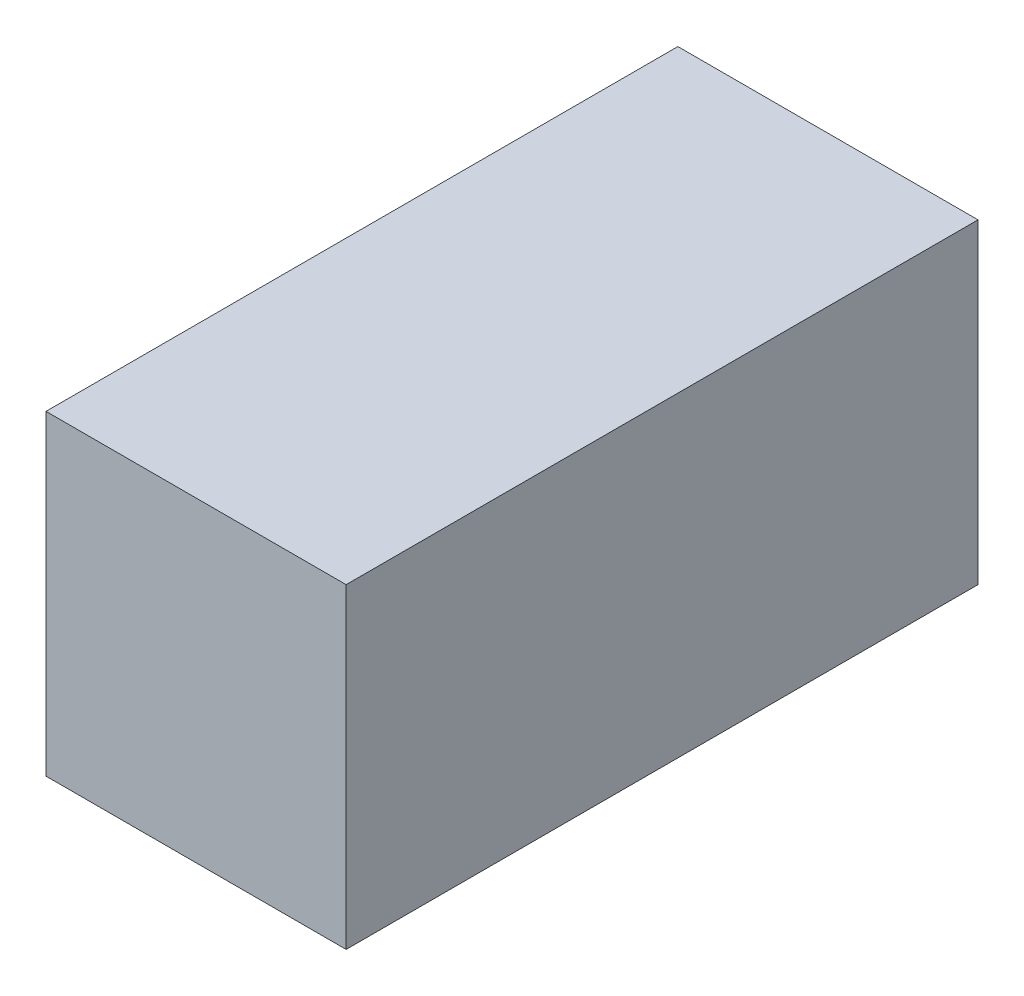
ISO-10303-21;
HEADER;
FILE_DESCRIPTION(('STEP AP214'),'2;1');
FILE_NAME('part.step','',(''),(''),'','','');
FILE_SCHEMA(('AUTOMOTIVE_DESIGN { 1 0 10303 214 1 1 1 1 }'));
ENDSEC;
DATA;
#1=APPLICATION_CONTEXT('core data for automotive mechanical design processes');
#2=APPLICATION_PROTOCOL_DEFINITION('international standard','automotive_design',2000,#1);
#3=PRODUCT_CONTEXT('',#1,'mechanical');
#4=PRODUCT('Part','Part','',(#3));
#5=PRODUCT_RELATED_PRODUCT_CATEGORY('part','',(#4));
#6=PRODUCT_DEFINITION_FORMATION('','',#4);
#7=PRODUCT_DEFINITION_CONTEXT('part definition',#1,'design');
#8=PRODUCT_DEFINITION('design','',#6,#7);
#9=PRODUCT_DEFINITION_SHAPE('','',#8);
#10=(LENGTH_UNIT() NAMED_UNIT(*) SI_UNIT(.MILLI.,.METRE.));
#11=(NAMED_UNIT(*) PLANE_ANGLE_UNIT() SI_UNIT($,.RADIAN.));
#12=(NAMED_UNIT(*) SI_UNIT($,.STERADIAN.) SOLID_ANGLE_UNIT());
#13=UNCERTAINTY_MEASURE_WITH_UNIT(LENGTH_MEASURE(1.E-05),#10,'distance_accuracy_value','');
#14=(GEOMETRIC_REPRESENTATION_CONTEXT(3) GLOBAL_UNCERTAINTY_ASSIGNED_CONTEXT((#13)) GLOBAL_UNIT_ASSIGNED_CONTEXT((#10,
#11,#12)) REPRESENTATION_CONTEXT('',''));
#15=CARTESIAN_POINT('',(0.,0.,0.));
#16=DIRECTION('',(0.,0.,1.));
#17=DIRECTION('',(1.,0.,0.));
#18=AXIS2_PLACEMENT_3D('',#15,#16,#17);
#19=CARTESIAN_POINT('',(19.,0.,0.));
#20=DIRECTION('',(0.,0.,-1.));
#21=DIRECTION('',(-1.,0.,0.));
#22=AXIS2_PLACEMENT_3D('',#19,#20,#21);
#23=PLANE('',#22);
#24=DIRECTION('',(0.,-1.,0.));
#25=VECTOR('',#24,1.);
#26=CARTESIAN_POINT('',(0.,0.,0.));
#27=LINE('',#26,#25);
#28=CARTESIAN_POINT('',(0.,20.,0.));
#29=VERTEX_POINT('',#28);
#30=CARTESIAN_POINT('',(0.,0.,0.));
#31=VERTEX_POINT('',#30);
#32=EDGE_CURVE('E105',#29,#31,#27,.T.);
#33=ORIENTED_EDGE('',*,*,#32,.T.);
#34=DIRECTION('',(-1.,0.,0.));
#35=VECTOR('',#34,1.);
#36=CARTESIAN_POINT('',(19.,0.,0.));
#37=LINE('',#36,#35);
#38=CARTESIAN_POINT('',(19.,0.,0.));
#39=VERTEX_POINT('',#38);
#40=EDGE_CURVE('E11',#39,#31,#37,.T.);
#41=ORIENTED_EDGE('',*,*,#40,.F.);
#42=DIRECTION('',(0.,-1.,0.));
#43=VECTOR('',#42,1.);
#44=CARTESIAN_POINT('',(19.,0.,0.));
#45=LINE('',#44,#43);
#46=CARTESIAN_POINT('',(19.,20.,0.));
#47=VERTEX_POINT('',#46);
#48=EDGE_CURVE('E89',#47,#39,#45,.T.);
#49=ORIENTED_EDGE('',*,*,#48,.F.);
#50=DIRECTION('',(-1.,0.,0.));
#51=VECTOR('',#50,1.);
#52=CARTESIAN_POINT('',(19.,20.,0.));
#53=LINE('',#52,#51);
#54=EDGE_CURVE('E97',#47,#29,#53,.T.);
#55=ORIENTED_EDGE('',*,*,#54,.T.);
#56=EDGE_LOOP('',(#33,#41,#49,#55));
#57=FACE_BOUND('',#56,.T.);
#58=ADVANCED_FACE('F39',(#57),#23,.F.);
#59=CARTESIAN_POINT('',(19.,0.,0.));
#60=DIRECTION('',(0.,1.,0.));
#61=DIRECTION('',(0.,0.,1.));
#62=AXIS2_PLACEMENT_3D('',#59,#60,#61);
#63=PLANE('',#62);
#64=DIRECTION('',(0.,0.,-1.));
#65=VECTOR('',#64,1.);
#66=CARTESIAN_POINT('',(0.,0.,0.));
#67=LINE('',#66,#65);
#68=CARTESIAN_POINT('',(0.,0.,-40.));
#69=VERTEX_POINT('',#68);
#70=EDGE_CURVE('E92',#31,#69,#67,.T.);
#71=ORIENTED_EDGE('',*,*,#70,.T.);
#72=DIRECTION('',(-1.,0.,0.));
#73=VECTOR('',#72,1.);
#74=CARTESIAN_POINT('',(19.,0.,-40.));
#75=LINE('',#74,#73);
#76=CARTESIAN_POINT('',(19.,0.,-40.));
#77=VERTEX_POINT('',#76);
#78=EDGE_CURVE('E50',#77,#69,#75,.T.);
#79=ORIENTED_EDGE('',*,*,#78,.F.);
#80=DIRECTION('',(0.,0.,-1.));
#81=VECTOR('',#80,1.);
#82=CARTESIAN_POINT('',(19.,0.,0.));
#83=LINE('',#82,#81);
#84=EDGE_CURVE('E82',#39,#77,#83,.T.);
#85=ORIENTED_EDGE('',*,*,#84,.F.);
#86=ORIENTED_EDGE('',*,*,#40,.T.);
#87=EDGE_LOOP('',(#71,#79,#85,#86));
#88=FACE_BOUND('',#87,.T.);
#89=ADVANCED_FACE('F93',(#88),#63,.F.);
#90=CARTESIAN_POINT('',(19.,0.,-40.));
#91=DIRECTION('',(0.,0.,1.));
#92=DIRECTION('',(1.,0.,0.));
#93=AXIS2_PLACEMENT_3D('',#90,#91,#92);
#94=PLANE('',#93);
#95=DIRECTION('',(0.,1.,0.));
#96=VECTOR('',#95,1.);
#97=CARTESIAN_POINT('',(0.,0.,-40.));
#98=LINE('',#97,#96);
#99=CARTESIAN_POINT('',(0.,20.,-40.));
#100=VERTEX_POINT('',#99);
#101=EDGE_CURVE('E72',#69,#100,#98,.T.);
#102=ORIENTED_EDGE('',*,*,#101,.T.);
#103=DIRECTION('',(-1.,0.,0.));
#104=VECTOR('',#103,1.);
#105=CARTESIAN_POINT('',(19.,20.,-40.));
#106=LINE('',#105,#104);
#107=CARTESIAN_POINT('',(19.,20.,-40.));
#108=VERTEX_POINT('',#107);
#109=EDGE_CURVE('E94',#108,#100,#106,.T.);
#110=ORIENTED_EDGE('',*,*,#109,.F.);
#111=DIRECTION('',(0.,1.,0.));
#112=VECTOR('',#111,1.);
#113=CARTESIAN_POINT('',(19.,0.,-40.));
#114=LINE('',#113,#112);
#115=EDGE_CURVE('E88',#77,#108,#114,.T.);
#116=ORIENTED_EDGE('',*,*,#115,.F.);
#117=ORIENTED_EDGE('',*,*,#78,.T.);
#118=EDGE_LOOP('',(#102,#110,#116,#117));
#119=FACE_BOUND('',#118,.T.);
#120=ADVANCED_FACE('F96',(#119),#94,.F.);
#121=CARTESIAN_POINT('',(19.,20.,0.));
#122=DIRECTION('',(0.,-1.,0.));
#123=DIRECTION('',(0.,0.,-1.));
#124=AXIS2_PLACEMENT_3D('',#121,#122,#123);
#125=PLANE('',#124);
#126=DIRECTION('',(0.,0.,1.));
#127=VECTOR('',#126,1.);
#128=CARTESIAN_POINT('',(0.,20.,0.));
#129=LINE('',#128,#127);
#130=EDGE_CURVE('E76',#100,#29,#129,.T.);
#131=ORIENTED_EDGE('',*,*,#130,.T.);
#132=ORIENTED_EDGE('',*,*,#54,.F.);
#133=DIRECTION('',(0.,0.,1.));
#134=VECTOR('',#133,1.);
#135=CARTESIAN_POINT('',(19.,20.,0.));
#136=LINE('',#135,#134);
#137=EDGE_CURVE('E54',#108,#47,#136,.T.);
#138=ORIENTED_EDGE('',*,*,#137,.F.);
#139=ORIENTED_EDGE('',*,*,#109,.T.);
#140=EDGE_LOOP('',(#131,#132,#138,#139));
#141=FACE_BOUND('',#140,.T.);
#142=ADVANCED_FACE('F108',(#141),#125,.F.);
#143=CARTESIAN_POINT('',(19.,0.,0.));
#144=DIRECTION('',(-1.,0.,0.));
#145=DIRECTION('',(0.,0.,1.));
#146=AXIS2_PLACEMENT_3D('',#143,#144,#145);
#147=PLANE('',#146);
#148=ORIENTED_EDGE('',*,*,#48,.T.);
#149=ORIENTED_EDGE('',*,*,#84,.T.);
#150=ORIENTED_EDGE('',*,*,#115,.T.);
#151=ORIENTED_EDGE('',*,*,#137,.T.);
#152=EDGE_LOOP('',(#148,#149,#150,#151));
#153=FACE_BOUND('',#152,.T.);
#154=ADVANCED_FACE('F86',(#153),#147,.F.);
#155=CARTESIAN_POINT('',(0.,0.,0.));
#156=DIRECTION('',(-1.,0.,0.));
#157=DIRECTION('',(0.,0.,1.));
#158=AXIS2_PLACEMENT_3D('',#155,#156,#157);
#159=PLANE('',#158);
#160=ORIENTED_EDGE('',*,*,#32,.F.);
#161=ORIENTED_EDGE('',*,*,#130,.F.);
#162=ORIENTED_EDGE('',*,*,#101,.F.);
#163=ORIENTED_EDGE('',*,*,#70,.F.);
#164=EDGE_LOOP('',(#160,#161,#162,#163));
#165=FACE_BOUND('',#164,.T.);
#166=ADVANCED_FACE('F115',(#165),#159,.T.);
#167=CLOSED_SHELL('',(#58,#89,#120,#142,#154,#166));
#168=MANIFOLD_SOLID_BREP('B2',#167);
#169=ADVANCED_BREP_SHAPE_REPRESENTATION('',(#18,#168),#14);
#170=SHAPE_DEFINITION_REPRESENTATION(#9,#169);
ENDSEC;
END-ISO-10303-21;
